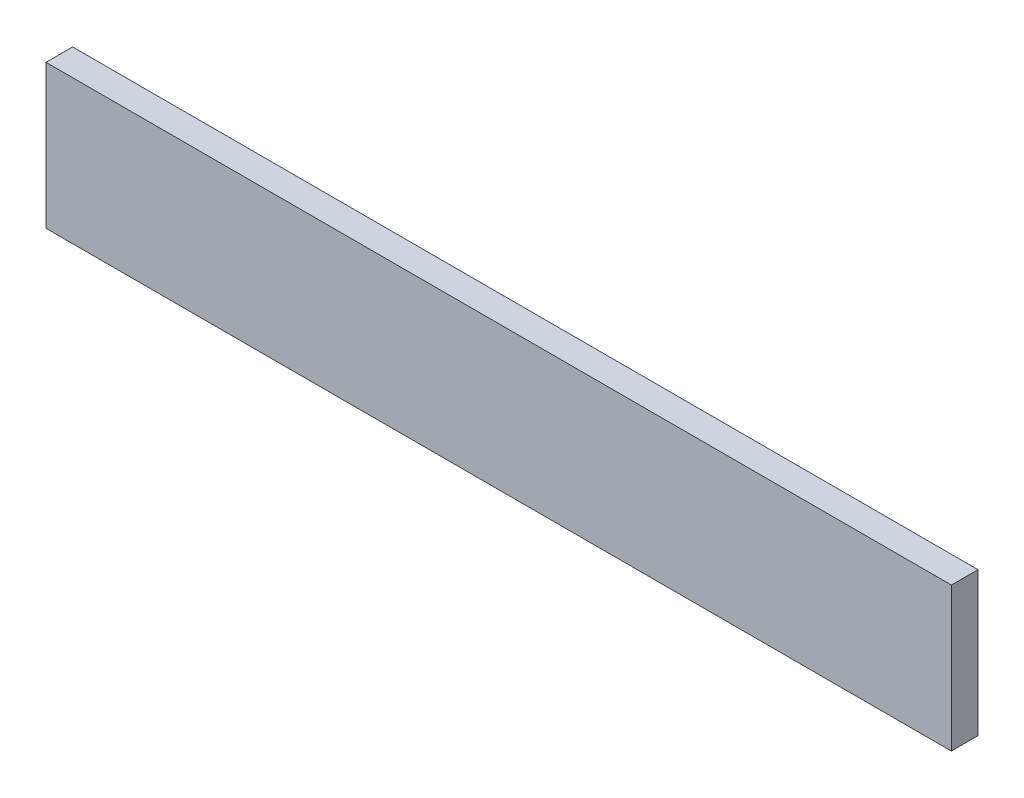
ISO-10303-21;
HEADER;
FILE_DESCRIPTION(('STEP AP214'),'2;1');
FILE_NAME('part.step','',(''),(''),'','','');
FILE_SCHEMA(('AUTOMOTIVE_DESIGN { 1 0 10303 214 1 1 1 1 }'));
ENDSEC;
DATA;
#1=APPLICATION_CONTEXT('core data for automotive mechanical design processes');
#2=APPLICATION_PROTOCOL_DEFINITION('international standard','automotive_design',2000,#1);
#3=PRODUCT_CONTEXT('',#1,'mechanical');
#4=PRODUCT('Part','Part','',(#3));
#5=PRODUCT_RELATED_PRODUCT_CATEGORY('part','',(#4));
#6=PRODUCT_DEFINITION_FORMATION('','',#4);
#7=PRODUCT_DEFINITION_CONTEXT('part definition',#1,'design');
#8=PRODUCT_DEFINITION('design','',#6,#7);
#9=PRODUCT_DEFINITION_SHAPE('','',#8);
#10=(LENGTH_UNIT() NAMED_UNIT(*) SI_UNIT(.MILLI.,.METRE.));
#11=(NAMED_UNIT(*) PLANE_ANGLE_UNIT() SI_UNIT($,.RADIAN.));
#12=(NAMED_UNIT(*) SI_UNIT($,.STERADIAN.) SOLID_ANGLE_UNIT());
#13=UNCERTAINTY_MEASURE_WITH_UNIT(LENGTH_MEASURE(1.E-05),#10,'distance_accuracy_value','');
#14=(GEOMETRIC_REPRESENTATION_CONTEXT(3) GLOBAL_UNCERTAINTY_ASSIGNED_CONTEXT((#13)) GLOBAL_UNIT_ASSIGNED_CONTEXT((#10,
#11,#12)) REPRESENTATION_CONTEXT('',''));
#15=CARTESIAN_POINT('',(0.,0.,0.));
#16=DIRECTION('',(0.,0.,1.));
#17=DIRECTION('',(1.,0.,0.));
#18=AXIS2_PLACEMENT_3D('',#15,#16,#17);
#19=CARTESIAN_POINT('',(0.,27.,0.));
#20=DIRECTION('',(1.,0.,0.));
#21=DIRECTION('',(0.,0.,-1.));
#22=AXIS2_PLACEMENT_3D('',#19,#20,#21);
#23=PLANE('',#22);
#24=DIRECTION('',(0.,0.,1.));
#25=VECTOR('',#24,1.);
#26=CARTESIAN_POINT('',(0.,0.,0.));
#27=LINE('',#26,#25);
#28=CARTESIAN_POINT('',(0.,0.,-5.));
#29=VERTEX_POINT('',#28);
#30=CARTESIAN_POINT('',(0.,0.,0.));
#31=VERTEX_POINT('',#30);
#32=EDGE_CURVE('E96',#29,#31,#27,.T.);
#33=ORIENTED_EDGE('',*,*,#32,.T.);
#34=DIRECTION('',(0.,-1.,0.));
#35=VECTOR('',#34,1.);
#36=CARTESIAN_POINT('',(0.,27.,0.));
#37=LINE('',#36,#35);
#38=CARTESIAN_POINT('',(0.,27.,0.));
#39=VERTEX_POINT('',#38);
#40=EDGE_CURVE('E11',#39,#31,#37,.T.);
#41=ORIENTED_EDGE('',*,*,#40,.F.);
#42=DIRECTION('',(0.,0.,1.));
#43=VECTOR('',#42,1.);
#44=CARTESIAN_POINT('',(0.,27.,0.));
#45=LINE('',#44,#43);
#46=CARTESIAN_POINT('',(0.,27.,-5.));
#47=VERTEX_POINT('',#46);
#48=EDGE_CURVE('E84',#47,#39,#45,.T.);
#49=ORIENTED_EDGE('',*,*,#48,.F.);
#50=DIRECTION('',(0.,-1.,0.));
#51=VECTOR('',#50,1.);
#52=CARTESIAN_POINT('',(0.,27.,-5.));
#53=LINE('',#52,#51);
#54=EDGE_CURVE('E92',#47,#29,#53,.T.);
#55=ORIENTED_EDGE('',*,*,#54,.T.);
#56=EDGE_LOOP('',(#33,#41,#49,#55));
#57=FACE_BOUND('',#56,.T.);
#58=ADVANCED_FACE('F33',(#57),#23,.F.);
#59=CARTESIAN_POINT('',(0.,27.,0.));
#60=DIRECTION('',(0.,0.,-1.));
#61=DIRECTION('',(-1.,0.,0.));
#62=AXIS2_PLACEMENT_3D('',#59,#60,#61);
#63=PLANE('',#62);
#64=DIRECTION('',(1.,0.,0.));
#65=VECTOR('',#64,1.);
#66=CARTESIAN_POINT('',(0.,0.,0.));
#67=LINE('',#66,#65);
#68=CARTESIAN_POINT('',(170.,0.,0.));
#69=VERTEX_POINT('',#68);
#70=EDGE_CURVE('E88',#31,#69,#67,.T.);
#71=ORIENTED_EDGE('',*,*,#70,.T.);
#72=DIRECTION('',(0.,-1.,0.));
#73=VECTOR('',#72,1.);
#74=CARTESIAN_POINT('',(170.,27.,0.));
#75=LINE('',#74,#73);
#76=CARTESIAN_POINT('',(170.,27.,0.));
#77=VERTEX_POINT('',#76);
#78=EDGE_CURVE('E41',#77,#69,#75,.T.);
#79=ORIENTED_EDGE('',*,*,#78,.F.);
#80=DIRECTION('',(1.,0.,0.));
#81=VECTOR('',#80,1.);
#82=CARTESIAN_POINT('',(0.,27.,0.));
#83=LINE('',#82,#81);
#84=EDGE_CURVE('E79',#39,#77,#83,.T.);
#85=ORIENTED_EDGE('',*,*,#84,.F.);
#86=ORIENTED_EDGE('',*,*,#40,.T.);
#87=EDGE_LOOP('',(#71,#79,#85,#86));
#88=FACE_BOUND('',#87,.T.);
#89=ADVANCED_FACE('F87',(#88),#63,.F.);
#90=CARTESIAN_POINT('',(170.,27.,0.));
#91=DIRECTION('',(-1.,0.,0.));
#92=DIRECTION('',(0.,0.,1.));
#93=AXIS2_PLACEMENT_3D('',#90,#91,#92);
#94=PLANE('',#93);
#95=DIRECTION('',(0.,0.,-1.));
#96=VECTOR('',#95,1.);
#97=CARTESIAN_POINT('',(170.,0.,0.));
#98=LINE('',#97,#96);
#99=CARTESIAN_POINT('',(170.,0.,-5.));
#100=VERTEX_POINT('',#99);
#101=EDGE_CURVE('E66',#69,#100,#98,.T.);
#102=ORIENTED_EDGE('',*,*,#101,.T.);
#103=DIRECTION('',(0.,-1.,0.));
#104=VECTOR('',#103,1.);
#105=CARTESIAN_POINT('',(170.,27.,-5.));
#106=LINE('',#105,#104);
#107=CARTESIAN_POINT('',(170.,27.,-5.));
#108=VERTEX_POINT('',#107);
#109=EDGE_CURVE('E89',#108,#100,#106,.T.);
#110=ORIENTED_EDGE('',*,*,#109,.F.);
#111=DIRECTION('',(0.,0.,-1.));
#112=VECTOR('',#111,1.);
#113=CARTESIAN_POINT('',(170.,27.,0.));
#114=LINE('',#113,#112);
#115=EDGE_CURVE('E82',#77,#108,#114,.T.);
#116=ORIENTED_EDGE('',*,*,#115,.F.);
#117=ORIENTED_EDGE('',*,*,#78,.T.);
#118=EDGE_LOOP('',(#102,#110,#116,#117));
#119=FACE_BOUND('',#118,.T.);
#120=ADVANCED_FACE('F90',(#119),#94,.F.);
#121=CARTESIAN_POINT('',(0.,27.,-5.));
#122=DIRECTION('',(0.,0.,1.));
#123=DIRECTION('',(1.,0.,0.));
#124=AXIS2_PLACEMENT_3D('',#121,#122,#123);
#125=PLANE('',#124);
#126=DIRECTION('',(-1.,0.,0.));
#127=VECTOR('',#126,1.);
#128=CARTESIAN_POINT('',(0.,0.,-5.));
#129=LINE('',#128,#127);
#130=EDGE_CURVE('E72',#100,#29,#129,.T.);
#131=ORIENTED_EDGE('',*,*,#130,.T.);
#132=ORIENTED_EDGE('',*,*,#54,.F.);
#133=DIRECTION('',(-1.,0.,0.));
#134=VECTOR('',#133,1.);
#135=CARTESIAN_POINT('',(0.,27.,-5.));
#136=LINE('',#135,#134);
#137=EDGE_CURVE('E49',#108,#47,#136,.T.);
#138=ORIENTED_EDGE('',*,*,#137,.F.);
#139=ORIENTED_EDGE('',*,*,#109,.T.);
#140=EDGE_LOOP('',(#131,#132,#138,#139));
#141=FACE_BOUND('',#140,.T.);
#142=ADVANCED_FACE('F103',(#141),#125,.F.);
#143=CARTESIAN_POINT('',(0.,27.,0.));
#144=DIRECTION('',(0.,-1.,0.));
#145=DIRECTION('',(0.,0.,-1.));
#146=AXIS2_PLACEMENT_3D('',#143,#144,#145);
#147=PLANE('',#146);
#148=ORIENTED_EDGE('',*,*,#48,.T.);
#149=ORIENTED_EDGE('',*,*,#84,.T.);
#150=ORIENTED_EDGE('',*,*,#115,.T.);
#151=ORIENTED_EDGE('',*,*,#137,.T.);
#152=EDGE_LOOP('',(#148,#149,#150,#151));
#153=FACE_BOUND('',#152,.T.);
#154=ADVANCED_FACE('F80',(#153),#147,.F.);
#155=CARTESIAN_POINT('',(0.,0.,0.));
#156=DIRECTION('',(0.,-1.,0.));
#157=DIRECTION('',(0.,0.,-1.));
#158=AXIS2_PLACEMENT_3D('',#155,#156,#157);
#159=PLANE('',#158);
#160=ORIENTED_EDGE('',*,*,#32,.F.);
#161=ORIENTED_EDGE('',*,*,#130,.F.);
#162=ORIENTED_EDGE('',*,*,#101,.F.);
#163=ORIENTED_EDGE('',*,*,#70,.F.);
#164=EDGE_LOOP('',(#160,#161,#162,#163));
#165=FACE_BOUND('',#164,.T.);
#166=ADVANCED_FACE('F106',(#165),#159,.T.);
#167=CLOSED_SHELL('',(#58,#89,#120,#142,#154,#166));
#168=MANIFOLD_SOLID_BREP('B2',#167);
#169=ADVANCED_BREP_SHAPE_REPRESENTATION('',(#18,#168),#14);
#170=SHAPE_DEFINITION_REPRESENTATION(#9,#169);
ENDSEC;
END-ISO-10303-21;
